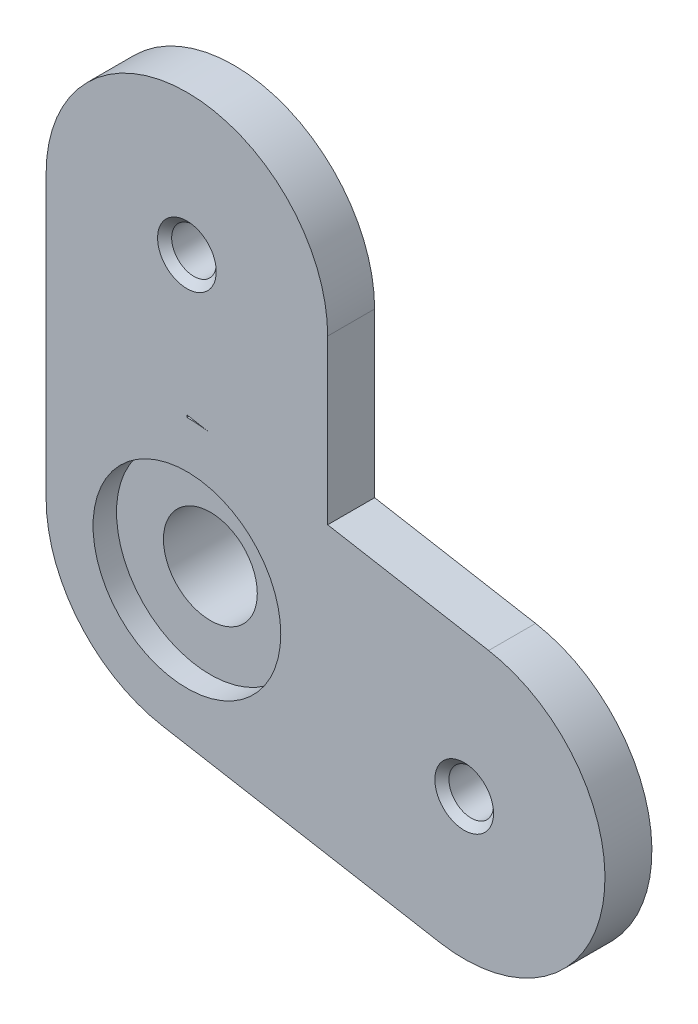
ISO-10303-21;
HEADER;
FILE_DESCRIPTION(('STEP AP214'),'2;1');
FILE_NAME('part.step','',(''),(''),'','','');
FILE_SCHEMA(('AUTOMOTIVE_DESIGN { 1 0 10303 214 1 1 1 1 }'));
ENDSEC;
DATA;
#1=APPLICATION_CONTEXT('core data for automotive mechanical design processes');
#2=APPLICATION_PROTOCOL_DEFINITION('international standard','automotive_design',2000,#1);
#3=PRODUCT_CONTEXT('',#1,'mechanical');
#4=PRODUCT('Part','Part','',(#3));
#5=PRODUCT_RELATED_PRODUCT_CATEGORY('part','',(#4));
#6=PRODUCT_DEFINITION_FORMATION('','',#4);
#7=PRODUCT_DEFINITION_CONTEXT('part definition',#1,'design');
#8=PRODUCT_DEFINITION('design','',#6,#7);
#9=PRODUCT_DEFINITION_SHAPE('','',#8);
#10=(LENGTH_UNIT() NAMED_UNIT(*) SI_UNIT(.MILLI.,.METRE.));
#11=(NAMED_UNIT(*) PLANE_ANGLE_UNIT() SI_UNIT($,.RADIAN.));
#12=(NAMED_UNIT(*) SI_UNIT($,.STERADIAN.) SOLID_ANGLE_UNIT());
#13=UNCERTAINTY_MEASURE_WITH_UNIT(LENGTH_MEASURE(1.E-05),#10,'distance_accuracy_value','');
#14=(GEOMETRIC_REPRESENTATION_CONTEXT(3) GLOBAL_UNCERTAINTY_ASSIGNED_CONTEXT((#13)) GLOBAL_UNIT_ASSIGNED_CONTEXT((#10,
#11,#12)) REPRESENTATION_CONTEXT('',''));
#15=CARTESIAN_POINT('',(0.,0.,0.));
#16=DIRECTION('',(0.,0.,1.));
#17=DIRECTION('',(1.,0.,0.));
#18=AXIS2_PLACEMENT_3D('',#15,#16,#17);
#19=CARTESIAN_POINT('',(0.,0.,1.));
#20=DIRECTION('',(0.,0.,-1.));
#21=DIRECTION('',(-1.,0.,0.));
#22=AXIS2_PLACEMENT_3D('',#19,#20,#21);
#23=CYLINDRICAL_SURFACE('',#22,1.);
#24=CARTESIAN_POINT('',(0.,0.,-1.55662432702596));
#25=DIRECTION('',(-0.499999999999995,0.,0.866025403784442));
#26=DIRECTION('',(-0.866025403784442,0.,-0.499999999999995));
#27=AXIS2_PLACEMENT_3D('',#24,#25,#26);
#28=ELLIPSE('',#27,1.15470053837925,1.);
#29=CARTESIAN_POINT('',(-1.,0.,-2.13397459621557));
#30=VERTEX_POINT('',#29);
#31=EDGE_CURVE('E193',#30,#30,#28,.F.);
#32=ORIENTED_EDGE('',*,*,#31,.T.);
#33=EDGE_LOOP('',(#32));
#34=FACE_BOUND('',#33,.T.);
#35=CARTESIAN_POINT('',(0.,0.,0.5));
#36=DIRECTION('',(0.,0.,1.));
#37=DIRECTION('',(1.,0.,0.));
#38=AXIS2_PLACEMENT_3D('',#35,#36,#37);
#39=CIRCLE('',#38,1.);
#40=CARTESIAN_POINT('',(1.,0.,0.5));
#41=VERTEX_POINT('',#40);
#42=EDGE_CURVE('E146',#41,#41,#39,.F.);
#43=ORIENTED_EDGE('',*,*,#42,.F.);
#44=EDGE_LOOP('',(#43));
#45=FACE_BOUND('',#44,.T.);
#46=ADVANCED_FACE('F36',(#34,#45),#23,.F.);
#47=CARTESIAN_POINT('',(0.,0.,1.));
#48=DIRECTION('',(0.,0.,-1.));
#49=DIRECTION('',(-1.,0.,0.));
#50=AXIS2_PLACEMENT_3D('',#47,#48,#49);
#51=CYLINDRICAL_SURFACE('',#50,3.);
#52=CARTESIAN_POINT('',(0.,0.,0.));
#53=DIRECTION('',(0.,0.,1.));
#54=DIRECTION('',(1.,0.,0.));
#55=AXIS2_PLACEMENT_3D('',#52,#53,#54);
#56=CIRCLE('',#55,3.);
#57=CARTESIAN_POINT('',(0.520944533000802,2.95442325903662,0.));
#58=VERTEX_POINT('',#57);
#59=CARTESIAN_POINT('',(0.,3.,0.));
#60=VERTEX_POINT('',#59);
#61=EDGE_CURVE('E131',#58,#60,#56,.T.);
#62=ORIENTED_EDGE('',*,*,#61,.T.);
#63=DIRECTION('',(0.,0.,-1.));
#64=VECTOR('',#63,1.);
#65=CARTESIAN_POINT('',(0.,3.,1.));
#66=LINE('',#65,#64);
#67=CARTESIAN_POINT('',(0.,3.,1.));
#68=VERTEX_POINT('',#67);
#69=EDGE_CURVE('E46',#68,#60,#66,.T.);
#70=ORIENTED_EDGE('',*,*,#69,.F.);
#71=CARTESIAN_POINT('',(0.,0.,1.));
#72=DIRECTION('',(0.,0.,1.));
#73=DIRECTION('',(1.,0.,0.));
#74=AXIS2_PLACEMENT_3D('',#71,#72,#73);
#75=CIRCLE('',#74,3.);
#76=CARTESIAN_POINT('',(0.520944533000802,2.95442325903662,1.));
#77=VERTEX_POINT('',#76);
#78=EDGE_CURVE('E120',#77,#68,#75,.T.);
#79=ORIENTED_EDGE('',*,*,#78,.F.);
#80=DIRECTION('',(0.,0.,-1.));
#81=VECTOR('',#80,1.);
#82=CARTESIAN_POINT('',(0.520944533000802,2.95442325903662,1.));
#83=LINE('',#82,#81);
#84=EDGE_CURVE('E168',#77,#58,#83,.T.);
#85=ORIENTED_EDGE('',*,*,#84,.T.);
#86=EDGE_LOOP('',(#62,#70,#79,#85));
#87=FACE_BOUND('',#86,.T.);
#88=ADVANCED_FACE('F129',(#87),#51,.T.);
#89=CARTESIAN_POINT('',(0.,0.,1.));
#90=DIRECTION('',(1.,0.,0.));
#91=DIRECTION('',(0.,1.,0.));
#92=AXIS2_PLACEMENT_3D('',#89,#90,#91);
#93=PLANE('',#92);
#94=DIRECTION('',(0.,-1.,0.));
#95=VECTOR('',#94,1.);
#96=CARTESIAN_POINT('',(0.,0.,0.));
#97=LINE('',#96,#95);
#98=CARTESIAN_POINT('',(0.,3.04627983565724,0.));
#99=VERTEX_POINT('',#98);
#100=EDGE_CURVE('E164',#99,#60,#97,.T.);
#101=ORIENTED_EDGE('',*,*,#100,.F.);
#102=DIRECTION('',(0.,0.,-1.));
#103=VECTOR('',#102,1.);
#104=CARTESIAN_POINT('',(0.,3.04627983565724,1.));
#105=LINE('',#104,#103);
#106=CARTESIAN_POINT('',(0.,3.04627983565724,1.));
#107=VERTEX_POINT('',#106);
#108=EDGE_CURVE('E89',#107,#99,#105,.T.);
#109=ORIENTED_EDGE('',*,*,#108,.F.);
#110=DIRECTION('',(0.,-1.,0.));
#111=VECTOR('',#110,1.);
#112=CARTESIAN_POINT('',(0.,0.,1.));
#113=LINE('',#112,#111);
#114=EDGE_CURVE('E124',#107,#68,#113,.T.);
#115=ORIENTED_EDGE('',*,*,#114,.T.);
#116=ORIENTED_EDGE('',*,*,#69,.T.);
#117=EDGE_LOOP('',(#101,#109,#115,#116));
#118=FACE_BOUND('',#117,.T.);
#119=ADVANCED_FACE('F136',(#118),#93,.T.);
#120=CARTESIAN_POINT('',(-0.520944533000801,-2.95442325903663,1.));
#121=DIRECTION('',(-0.173648177666934,-0.984807753012208,0.));
#122=DIRECTION('',(0.984807753012208,-0.173648177666934,0.));
#123=AXIS2_PLACEMENT_3D('',#120,#121,#122);
#124=PLANE('',#123);
#125=DIRECTION('',(-0.984807753012208,0.173648177666934,0.));
#126=VECTOR('',#125,1.);
#127=CARTESIAN_POINT('',(-0.520944533000801,-2.95442325903663,0.));
#128=LINE('',#127,#126);
#129=CARTESIAN_POINT('',(5.38790198507244,-3.99631232503823,0.));
#130=VERTEX_POINT('',#129);
#131=CARTESIAN_POINT('',(-0.520944533000802,-2.95442325903662,0.));
#132=VERTEX_POINT('',#131);
#133=EDGE_CURVE('E142',#130,#132,#128,.T.);
#134=ORIENTED_EDGE('',*,*,#133,.F.);
#135=DIRECTION('',(0.,0.,-1.));
#136=VECTOR('',#135,1.);
#137=CARTESIAN_POINT('',(5.38790198507244,-3.99631232503823,1.));
#138=LINE('',#137,#136);
#139=CARTESIAN_POINT('',(5.38790198507244,-3.99631232503823,1.));
#140=VERTEX_POINT('',#139);
#141=EDGE_CURVE('E100',#140,#130,#138,.T.);
#142=ORIENTED_EDGE('',*,*,#141,.F.);
#143=DIRECTION('',(-0.984807753012208,0.173648177666934,0.));
#144=VECTOR('',#143,1.);
#145=CARTESIAN_POINT('',(-0.520944533000801,-2.95442325903663,1.));
#146=LINE('',#145,#144);
#147=CARTESIAN_POINT('',(-0.520944533000802,-2.95442325903662,1.));
#148=VERTEX_POINT('',#147);
#149=EDGE_CURVE('E167',#140,#148,#146,.T.);
#150=ORIENTED_EDGE('',*,*,#149,.T.);
#151=DIRECTION('',(0.,0.,-1.));
#152=VECTOR('',#151,1.);
#153=CARTESIAN_POINT('',(-0.520944533000802,-2.95442325903662,1.));
#154=LINE('',#153,#152);
#155=EDGE_CURVE('E138',#148,#132,#154,.T.);
#156=ORIENTED_EDGE('',*,*,#155,.T.);
#157=EDGE_LOOP('',(#134,#142,#150,#156));
#158=FACE_BOUND('',#157,.T.);
#159=ADVANCED_FACE('F38',(#158),#124,.T.);
#160=CARTESIAN_POINT('',(5.90884651807324,-1.0418890660016,1.));
#161=DIRECTION('',(0.,0.,-1.));
#162=DIRECTION('',(-1.,0.,0.));
#163=AXIS2_PLACEMENT_3D('',#160,#161,#162);
#164=CYLINDRICAL_SURFACE('',#163,3.);
#165=CARTESIAN_POINT('',(5.90884651807324,-1.0418890660016,0.));
#166=DIRECTION('',(0.,0.,1.));
#167=DIRECTION('',(1.,0.,0.));
#168=AXIS2_PLACEMENT_3D('',#165,#166,#167);
#169=CIRCLE('',#168,3.);
#170=CARTESIAN_POINT('',(6.42979105107405,1.91253419303502,0.));
#171=VERTEX_POINT('',#170);
#172=EDGE_CURVE('E145',#130,#171,#169,.T.);
#173=ORIENTED_EDGE('',*,*,#172,.T.);
#174=DIRECTION('',(0.,0.,-1.));
#175=VECTOR('',#174,1.);
#176=CARTESIAN_POINT('',(6.42979105107405,1.91253419303502,1.));
#177=LINE('',#176,#175);
#178=CARTESIAN_POINT('',(6.42979105107405,1.91253419303502,1.));
#179=VERTEX_POINT('',#178);
#180=EDGE_CURVE('E181',#179,#171,#177,.T.);
#181=ORIENTED_EDGE('',*,*,#180,.F.);
#182=CARTESIAN_POINT('',(5.90884651807324,-1.0418890660016,1.));
#183=DIRECTION('',(0.,0.,1.));
#184=DIRECTION('',(1.,0.,0.));
#185=AXIS2_PLACEMENT_3D('',#182,#183,#184);
#186=CIRCLE('',#185,3.);
#187=EDGE_CURVE('E212',#140,#179,#186,.T.);
#188=ORIENTED_EDGE('',*,*,#187,.F.);
#189=ORIENTED_EDGE('',*,*,#141,.T.);
#190=EDGE_LOOP('',(#173,#181,#188,#189));
#191=FACE_BOUND('',#190,.T.);
#192=ADVANCED_FACE('F232',(#191),#164,.T.);
#193=CARTESIAN_POINT('',(0.520944533000802,2.95442325903662,1.));
#194=DIRECTION('',(0.173648177666934,0.984807753012207,0.));
#195=DIRECTION('',(-0.984807753012208,0.173648177666934,0.));
#196=AXIS2_PLACEMENT_3D('',#193,#194,#195);
#197=PLANE('',#196);
#198=DIRECTION('',(0.984807753012208,-0.173648177666934,0.));
#199=VECTOR('',#198,1.);
#200=CARTESIAN_POINT('',(0.520944533000802,2.95442325903662,0.));
#201=LINE('',#200,#199);
#202=CARTESIAN_POINT('',(3.,2.51729889353183,0.));
#203=VERTEX_POINT('',#202);
#204=EDGE_CURVE('E149',#203,#171,#201,.T.);
#205=ORIENTED_EDGE('',*,*,#204,.F.);
#206=DIRECTION('',(0.,0.,-1.));
#207=VECTOR('',#206,1.);
#208=CARTESIAN_POINT('',(3.,2.51729889353183,1.));
#209=LINE('',#208,#207);
#210=CARTESIAN_POINT('',(3.,2.51729889353183,1.));
#211=VERTEX_POINT('',#210);
#212=EDGE_CURVE('E179',#211,#203,#209,.T.);
#213=ORIENTED_EDGE('',*,*,#212,.F.);
#214=DIRECTION('',(0.984807753012208,-0.173648177666934,0.));
#215=VECTOR('',#214,1.);
#216=CARTESIAN_POINT('',(0.520944533000802,2.95442325903662,1.));
#217=LINE('',#216,#215);
#218=EDGE_CURVE('E214',#211,#179,#217,.T.);
#219=ORIENTED_EDGE('',*,*,#218,.T.);
#220=ORIENTED_EDGE('',*,*,#180,.T.);
#221=EDGE_LOOP('',(#205,#213,#219,#220));
#222=FACE_BOUND('',#221,.T.);
#223=ADVANCED_FACE('F237',(#222),#197,.T.);
#224=CARTESIAN_POINT('',(3.,0.,1.));
#225=DIRECTION('',(-1.,0.,0.));
#226=DIRECTION('',(0.,-1.,0.));
#227=AXIS2_PLACEMENT_3D('',#224,#225,#226);
#228=PLANE('',#227);
#229=DIRECTION('',(0.,1.,0.));
#230=VECTOR('',#229,1.);
#231=CARTESIAN_POINT('',(3.,0.,0.));
#232=LINE('',#231,#230);
#233=CARTESIAN_POINT('',(3.,6.,0.));
#234=VERTEX_POINT('',#233);
#235=EDGE_CURVE('E152',#203,#234,#232,.T.);
#236=ORIENTED_EDGE('',*,*,#235,.T.);
#237=DIRECTION('',(0.,0.,-1.));
#238=VECTOR('',#237,1.);
#239=CARTESIAN_POINT('',(3.,6.,1.));
#240=LINE('',#239,#238);
#241=CARTESIAN_POINT('',(3.,6.,1.));
#242=VERTEX_POINT('',#241);
#243=EDGE_CURVE('E176',#242,#234,#240,.T.);
#244=ORIENTED_EDGE('',*,*,#243,.F.);
#245=DIRECTION('',(0.,1.,0.));
#246=VECTOR('',#245,1.);
#247=CARTESIAN_POINT('',(3.,0.,1.));
#248=LINE('',#247,#246);
#249=EDGE_CURVE('E217',#211,#242,#248,.T.);
#250=ORIENTED_EDGE('',*,*,#249,.F.);
#251=ORIENTED_EDGE('',*,*,#212,.T.);
#252=EDGE_LOOP('',(#236,#244,#250,#251));
#253=FACE_BOUND('',#252,.T.);
#254=ADVANCED_FACE('F276',(#253),#228,.F.);
#255=CARTESIAN_POINT('',(0.,6.,1.));
#256=DIRECTION('',(0.,0.,-1.));
#257=DIRECTION('',(-1.,0.,0.));
#258=AXIS2_PLACEMENT_3D('',#255,#256,#257);
#259=CYLINDRICAL_SURFACE('',#258,3.);
#260=CARTESIAN_POINT('',(0.,6.,0.));
#261=DIRECTION('',(0.,0.,1.));
#262=DIRECTION('',(1.,0.,0.));
#263=AXIS2_PLACEMENT_3D('',#260,#261,#262);
#264=CIRCLE('',#263,3.);
#265=CARTESIAN_POINT('',(-3.,6.,0.));
#266=VERTEX_POINT('',#265);
#267=EDGE_CURVE('E154',#234,#266,#264,.T.);
#268=ORIENTED_EDGE('',*,*,#267,.T.);
#269=DIRECTION('',(0.,0.,-1.));
#270=VECTOR('',#269,1.);
#271=CARTESIAN_POINT('',(-3.,6.,1.));
#272=LINE('',#271,#270);
#273=CARTESIAN_POINT('',(-3.,6.,1.));
#274=VERTEX_POINT('',#273);
#275=EDGE_CURVE('E174',#274,#266,#272,.T.);
#276=ORIENTED_EDGE('',*,*,#275,.F.);
#277=CARTESIAN_POINT('',(0.,6.,1.));
#278=DIRECTION('',(0.,0.,1.));
#279=DIRECTION('',(1.,0.,0.));
#280=AXIS2_PLACEMENT_3D('',#277,#278,#279);
#281=CIRCLE('',#280,3.);
#282=EDGE_CURVE('E219',#242,#274,#281,.T.);
#283=ORIENTED_EDGE('',*,*,#282,.F.);
#284=ORIENTED_EDGE('',*,*,#243,.T.);
#285=EDGE_LOOP('',(#268,#276,#283,#284));
#286=FACE_BOUND('',#285,.T.);
#287=ADVANCED_FACE('F272',(#286),#259,.T.);
#288=CARTESIAN_POINT('',(-3.,0.,1.));
#289=DIRECTION('',(-1.,0.,0.));
#290=DIRECTION('',(0.,-1.,0.));
#291=AXIS2_PLACEMENT_3D('',#288,#289,#290);
#292=PLANE('',#291);
#293=DIRECTION('',(0.,1.,0.));
#294=VECTOR('',#293,1.);
#295=CARTESIAN_POINT('',(-3.,0.,0.));
#296=LINE('',#295,#294);
#297=CARTESIAN_POINT('',(-3.,0.,0.));
#298=VERTEX_POINT('',#297);
#299=EDGE_CURVE('E157',#298,#266,#296,.T.);
#300=ORIENTED_EDGE('',*,*,#299,.F.);
#301=DIRECTION('',(0.,0.,-1.));
#302=VECTOR('',#301,1.);
#303=CARTESIAN_POINT('',(-3.,0.,1.));
#304=LINE('',#303,#302);
#305=CARTESIAN_POINT('',(-3.,0.,1.));
#306=VERTEX_POINT('',#305);
#307=EDGE_CURVE('E172',#306,#298,#304,.T.);
#308=ORIENTED_EDGE('',*,*,#307,.F.);
#309=DIRECTION('',(0.,1.,0.));
#310=VECTOR('',#309,1.);
#311=CARTESIAN_POINT('',(-3.,0.,1.));
#312=LINE('',#311,#310);
#313=EDGE_CURVE('E221',#306,#274,#312,.T.);
#314=ORIENTED_EDGE('',*,*,#313,.T.);
#315=ORIENTED_EDGE('',*,*,#275,.T.);
#316=EDGE_LOOP('',(#300,#308,#314,#315));
#317=FACE_BOUND('',#316,.T.);
#318=ADVANCED_FACE('F269',(#317),#292,.T.);
#319=CARTESIAN_POINT('',(0.,0.,1.));
#320=DIRECTION('',(0.,0.,-1.));
#321=DIRECTION('',(-1.,0.,0.));
#322=AXIS2_PLACEMENT_3D('',#319,#320,#321);
#323=CYLINDRICAL_SURFACE('',#322,3.);
#324=CARTESIAN_POINT('',(0.,0.,0.));
#325=DIRECTION('',(0.,0.,1.));
#326=DIRECTION('',(1.,0.,0.));
#327=AXIS2_PLACEMENT_3D('',#324,#325,#326);
#328=CIRCLE('',#327,3.);
#329=EDGE_CURVE('E160',#298,#132,#328,.T.);
#330=ORIENTED_EDGE('',*,*,#329,.T.);
#331=ORIENTED_EDGE('',*,*,#155,.F.);
#332=CARTESIAN_POINT('',(0.,0.,1.));
#333=DIRECTION('',(0.,0.,1.));
#334=DIRECTION('',(1.,0.,0.));
#335=AXIS2_PLACEMENT_3D('',#332,#333,#334);
#336=CIRCLE('',#335,3.);
#337=EDGE_CURVE('E126',#306,#148,#336,.T.);
#338=ORIENTED_EDGE('',*,*,#337,.F.);
#339=ORIENTED_EDGE('',*,*,#307,.T.);
#340=EDGE_LOOP('',(#330,#331,#338,#339));
#341=FACE_BOUND('',#340,.T.);
#342=ADVANCED_FACE('F229',(#341),#323,.T.);
#343=CARTESIAN_POINT('',(0.520944533000802,2.95442325903662,1.));
#344=DIRECTION('',(0.173648177666934,0.984807753012207,0.));
#345=DIRECTION('',(-0.984807753012208,0.173648177666934,0.));
#346=AXIS2_PLACEMENT_3D('',#343,#344,#345);
#347=PLANE('',#346);
#348=DIRECTION('',(0.984807753012208,-0.173648177666934,0.));
#349=VECTOR('',#348,1.);
#350=CARTESIAN_POINT('',(0.520944533000802,2.95442325903662,0.));
#351=LINE('',#350,#349);
#352=EDGE_CURVE('E92',#99,#58,#351,.T.);
#353=ORIENTED_EDGE('',*,*,#352,.T.);
#354=ORIENTED_EDGE('',*,*,#84,.F.);
#355=DIRECTION('',(0.984807753012208,-0.173648177666934,0.));
#356=VECTOR('',#355,1.);
#357=CARTESIAN_POINT('',(0.520944533000802,2.95442325903662,1.));
#358=LINE('',#357,#356);
#359=EDGE_CURVE('E55',#107,#77,#358,.T.);
#360=ORIENTED_EDGE('',*,*,#359,.F.);
#361=ORIENTED_EDGE('',*,*,#108,.T.);
#362=EDGE_LOOP('',(#353,#354,#360,#361));
#363=FACE_BOUND('',#362,.T.);
#364=ADVANCED_FACE('F260',(#363),#347,.F.);
#365=CARTESIAN_POINT('',(0.,0.,1.));
#366=DIRECTION('',(0.,0.,1.));
#367=DIRECTION('',(1.,0.,0.));
#368=AXIS2_PLACEMENT_3D('',#365,#366,#367);
#369=PLANE('',#368);
#370=CARTESIAN_POINT('',(0.,6.,1.));
#371=DIRECTION('',(0.,0.,1.));
#372=DIRECTION('',(1.,0.,0.));
#373=AXIS2_PLACEMENT_3D('',#370,#371,#372);
#374=CIRCLE('',#373,0.625);
#375=CARTESIAN_POINT('',(0.625,6.,1.));
#376=VERTEX_POINT('',#375);
#377=EDGE_CURVE('E508',#376,#376,#374,.T.);
#378=ORIENTED_EDGE('',*,*,#377,.F.);
#379=EDGE_LOOP('',(#378));
#380=FACE_BOUND('',#379,.T.);
#381=CARTESIAN_POINT('',(5.90884651807324,-1.0418890660016,1.));
#382=DIRECTION('',(0.,0.,1.));
#383=DIRECTION('',(1.,0.,0.));
#384=AXIS2_PLACEMENT_3D('',#381,#382,#383);
#385=CIRCLE('',#384,0.625);
#386=CARTESIAN_POINT('',(6.53384651807324,-1.0418890660016,1.));
#387=VERTEX_POINT('',#386);
#388=EDGE_CURVE('E196',#387,#387,#385,.T.);
#389=ORIENTED_EDGE('',*,*,#388,.F.);
#390=EDGE_LOOP('',(#389));
#391=FACE_BOUND('',#390,.T.);
#392=CARTESIAN_POINT('',(0.,0.,1.));
#393=DIRECTION('',(0.,0.,1.));
#394=DIRECTION('',(1.,0.,0.));
#395=AXIS2_PLACEMENT_3D('',#392,#393,#394);
#396=CIRCLE('',#395,2.);
#397=CARTESIAN_POINT('',(2.,0.,1.));
#398=VERTEX_POINT('',#397);
#399=EDGE_CURVE('E206',#398,#398,#396,.T.);
#400=ORIENTED_EDGE('',*,*,#399,.F.);
#401=EDGE_LOOP('',(#400));
#402=FACE_BOUND('',#401,.T.);
#403=ORIENTED_EDGE('',*,*,#149,.F.);
#404=ORIENTED_EDGE('',*,*,#187,.T.);
#405=ORIENTED_EDGE('',*,*,#218,.F.);
#406=ORIENTED_EDGE('',*,*,#249,.T.);
#407=ORIENTED_EDGE('',*,*,#282,.T.);
#408=ORIENTED_EDGE('',*,*,#313,.F.);
#409=ORIENTED_EDGE('',*,*,#337,.T.);
#410=EDGE_LOOP('',(#403,#404,#405,#406,#407,#408,#409));
#411=FACE_BOUND('',#410,.T.);
#412=ORIENTED_EDGE('',*,*,#78,.T.);
#413=ORIENTED_EDGE('',*,*,#114,.F.);
#414=ORIENTED_EDGE('',*,*,#359,.T.);
#415=EDGE_LOOP('',(#412,#413,#414));
#416=FACE_BOUND('',#415,.T.);
#417=ADVANCED_FACE('F122',(#380,#391,#402,#411,#416),#369,.T.);
#418=CARTESIAN_POINT('',(0.,0.,0.));
#419=DIRECTION('',(0.,0.,1.));
#420=DIRECTION('',(1.,0.,0.));
#421=AXIS2_PLACEMENT_3D('',#418,#419,#420);
#422=PLANE('',#421);
#423=CARTESIAN_POINT('',(0.,6.,0.));
#424=DIRECTION('',(0.,0.,1.));
#425=DIRECTION('',(1.,0.,0.));
#426=AXIS2_PLACEMENT_3D('',#423,#424,#425);
#427=CIRCLE('',#426,0.474999999999999);
#428=CARTESIAN_POINT('',(0.475,6.,0.));
#429=VERTEX_POINT('',#428);
#430=EDGE_CURVE('E40',#429,#429,#427,.T.);
#431=ORIENTED_EDGE('',*,*,#430,.T.);
#432=EDGE_LOOP('',(#431));
#433=FACE_BOUND('',#432,.T.);
#434=CARTESIAN_POINT('',(5.90884651807324,-1.0418890660016,0.));
#435=DIRECTION('',(0.,0.,1.));
#436=DIRECTION('',(1.,0.,0.));
#437=AXIS2_PLACEMENT_3D('',#434,#435,#436);
#438=CIRCLE('',#437,0.474999999999999);
#439=CARTESIAN_POINT('',(6.38384651807324,-1.0418890660016,0.));
#440=VERTEX_POINT('',#439);
#441=EDGE_CURVE('E186',#440,#440,#438,.T.);
#442=ORIENTED_EDGE('',*,*,#441,.T.);
#443=EDGE_LOOP('',(#442));
#444=FACE_BOUND('',#443,.T.);
#445=CARTESIAN_POINT('',(0.,0.,0.));
#446=DIRECTION('',(0.,0.,1.));
#447=DIRECTION('',(1.,0.,0.));
#448=AXIS2_PLACEMENT_3D('',#445,#446,#447);
#449=CIRCLE('',#448,2.5);
#450=CARTESIAN_POINT('',(2.5,0.,0.));
#451=VERTEX_POINT('',#450);
#452=EDGE_CURVE('E11',#451,#451,#449,.F.);
#453=ORIENTED_EDGE('',*,*,#452,.F.);
#454=EDGE_LOOP('',(#453));
#455=FACE_BOUND('',#454,.T.);
#456=ORIENTED_EDGE('',*,*,#133,.T.);
#457=ORIENTED_EDGE('',*,*,#329,.F.);
#458=ORIENTED_EDGE('',*,*,#299,.T.);
#459=ORIENTED_EDGE('',*,*,#267,.F.);
#460=ORIENTED_EDGE('',*,*,#235,.F.);
#461=ORIENTED_EDGE('',*,*,#204,.T.);
#462=ORIENTED_EDGE('',*,*,#172,.F.);
#463=EDGE_LOOP('',(#456,#457,#458,#459,#460,#461,#462));
#464=FACE_BOUND('',#463,.T.);
#465=ORIENTED_EDGE('',*,*,#61,.F.);
#466=ORIENTED_EDGE('',*,*,#352,.F.);
#467=ORIENTED_EDGE('',*,*,#100,.T.);
#468=EDGE_LOOP('',(#465,#466,#467));
#469=FACE_BOUND('',#468,.T.);
#470=ADVANCED_FACE('F256',(#433,#444,#455,#464,#469),#422,.F.);
#471=CARTESIAN_POINT('',(0.,0.,-3.));
#472=DIRECTION('',(0.,0.,1.));
#473=DIRECTION('',(1.,0.,0.));
#474=AXIS2_PLACEMENT_3D('',#471,#472,#473);
#475=CYLINDRICAL_SURFACE('',#474,2.5);
#476=CARTESIAN_POINT('',(0.,0.,-1.55662432702596));
#477=DIRECTION('',(-0.499999999999995,0.,0.866025403784442));
#478=DIRECTION('',(0.866025403784442,0.,0.499999999999995));
#479=AXIS2_PLACEMENT_3D('',#476,#477,#478);
#480=ELLIPSE('',#479,2.88675134594812,2.5);
#481=CARTESIAN_POINT('',(2.5,0.,-0.113248654051913));
#482=VERTEX_POINT('',#481);
#483=EDGE_CURVE('E188',#482,#482,#480,.T.);
#484=ORIENTED_EDGE('',*,*,#483,.T.);
#485=EDGE_LOOP('',(#484));
#486=FACE_BOUND('',#485,.T.);
#487=ORIENTED_EDGE('',*,*,#452,.T.);
#488=EDGE_LOOP('',(#487));
#489=FACE_BOUND('',#488,.T.);
#490=ADVANCED_FACE('F252',(#486,#489),#475,.T.);
#491=CARTESIAN_POINT('',(0.,0.,0.5));
#492=DIRECTION('',(0.,0.,1.));
#493=DIRECTION('',(1.,0.,0.));
#494=AXIS2_PLACEMENT_3D('',#491,#492,#493);
#495=PLANE('',#494);
#496=CARTESIAN_POINT('',(0.,0.,0.5));
#497=DIRECTION('',(0.,0.,1.));
#498=DIRECTION('',(1.,0.,0.));
#499=AXIS2_PLACEMENT_3D('',#496,#497,#498);
#500=CIRCLE('',#499,2.);
#501=CARTESIAN_POINT('',(2.,0.,0.5));
#502=VERTEX_POINT('',#501);
#503=EDGE_CURVE('E185',#502,#502,#500,.T.);
#504=ORIENTED_EDGE('',*,*,#503,.T.);
#505=EDGE_LOOP('',(#504));
#506=FACE_BOUND('',#505,.T.);
#507=ORIENTED_EDGE('',*,*,#42,.T.);
#508=EDGE_LOOP('',(#507));
#509=FACE_BOUND('',#508,.T.);
#510=ADVANCED_FACE('F255',(#506,#509),#495,.T.);
#511=CARTESIAN_POINT('',(0.,0.,0.5));
#512=DIRECTION('',(0.,0.,1.));
#513=DIRECTION('',(1.,0.,0.));
#514=AXIS2_PLACEMENT_3D('',#511,#512,#513);
#515=CYLINDRICAL_SURFACE('',#514,2.);
#516=ORIENTED_EDGE('',*,*,#503,.F.);
#517=EDGE_LOOP('',(#516));
#518=FACE_BOUND('',#517,.T.);
#519=ORIENTED_EDGE('',*,*,#399,.T.);
#520=EDGE_LOOP('',(#519));
#521=FACE_BOUND('',#520,.T.);
#522=ADVANCED_FACE('F250',(#518,#521),#515,.F.);
#523=CARTESIAN_POINT('',(-2.5,-4.04188906600161,-3.));
#524=DIRECTION('',(-0.499999999999995,0.,0.866025403784442));
#525=DIRECTION('',(0.866025403784442,0.,0.499999999999995));
#526=AXIS2_PLACEMENT_3D('',#523,#524,#525);
#527=PLANE('',#526);
#528=ORIENTED_EDGE('',*,*,#483,.F.);
#529=EDGE_LOOP('',(#528));
#530=FACE_BOUND('',#529,.T.);
#531=ORIENTED_EDGE('',*,*,#31,.F.);
#532=EDGE_LOOP('',(#531));
#533=FACE_BOUND('',#532,.T.);
#534=ADVANCED_FACE('F346',(#530,#533),#527,.F.);
#535=CARTESIAN_POINT('',(5.90884651807324,-1.0418890660016,1.));
#536=DIRECTION('',(0.,0.,1.));
#537=DIRECTION('',(1.,0.,0.));
#538=AXIS2_PLACEMENT_3D('',#535,#536,#537);
#539=CYLINDRICAL_SURFACE('',#538,0.474999999999999);
#540=CARTESIAN_POINT('',(5.90884651807324,-1.0418890660016,0.85));
#541=DIRECTION('',(0.,0.,1.));
#542=DIRECTION('',(1.,0.,0.));
#543=AXIS2_PLACEMENT_3D('',#540,#541,#542);
#544=CIRCLE('',#543,0.475);
#545=CARTESIAN_POINT('',(6.38384651807324,-1.0418890660016,0.85));
#546=VERTEX_POINT('',#545);
#547=EDGE_CURVE('E189',#546,#546,#544,.T.);
#548=ORIENTED_EDGE('',*,*,#547,.T.);
#549=EDGE_LOOP('',(#548));
#550=FACE_BOUND('',#549,.T.);
#551=ORIENTED_EDGE('',*,*,#441,.F.);
#552=EDGE_LOOP('',(#551));
#553=FACE_BOUND('',#552,.T.);
#554=ADVANCED_FACE('F352',(#550,#553),#539,.F.);
#555=CARTESIAN_POINT('',(5.90884651807324,-1.0418890660016,1.));
#556=DIRECTION('',(0.,0.,1.));
#557=DIRECTION('',(1.,0.,0.));
#558=AXIS2_PLACEMENT_3D('',#555,#556,#557);
#559=CONICAL_SURFACE('',#558,0.625,0.785398163397448);
#560=ORIENTED_EDGE('',*,*,#547,.F.);
#561=EDGE_LOOP('',(#560));
#562=FACE_BOUND('',#561,.T.);
#563=ORIENTED_EDGE('',*,*,#388,.T.);
#564=EDGE_LOOP('',(#563));
#565=FACE_BOUND('',#564,.T.);
#566=ADVANCED_FACE('F360',(#562,#565),#559,.F.);
#567=CARTESIAN_POINT('',(0.,6.,1.));
#568=DIRECTION('',(0.,0.,1.));
#569=DIRECTION('',(1.,0.,0.));
#570=AXIS2_PLACEMENT_3D('',#567,#568,#569);
#571=CYLINDRICAL_SURFACE('',#570,0.474999999999999);
#572=CARTESIAN_POINT('',(0.,6.,0.85));
#573=DIRECTION('',(0.,0.,1.));
#574=DIRECTION('',(1.,0.,0.));
#575=AXIS2_PLACEMENT_3D('',#572,#573,#574);
#576=CIRCLE('',#575,0.474999999999999);
#577=CARTESIAN_POINT('',(0.475,6.,0.85));
#578=VERTEX_POINT('',#577);
#579=EDGE_CURVE('E505',#578,#578,#576,.T.);
#580=ORIENTED_EDGE('',*,*,#579,.T.);
#581=EDGE_LOOP('',(#580));
#582=FACE_BOUND('',#581,.T.);
#583=ORIENTED_EDGE('',*,*,#430,.F.);
#584=EDGE_LOOP('',(#583));
#585=FACE_BOUND('',#584,.T.);
#586=ADVANCED_FACE('F367',(#582,#585),#571,.F.);
#587=CARTESIAN_POINT('',(0.,6.,1.));
#588=DIRECTION('',(0.,0.,1.));
#589=DIRECTION('',(1.,0.,0.));
#590=AXIS2_PLACEMENT_3D('',#587,#588,#589);
#591=CONICAL_SURFACE('',#590,0.625,0.78539816339745);
#592=ORIENTED_EDGE('',*,*,#579,.F.);
#593=EDGE_LOOP('',(#592));
#594=FACE_BOUND('',#593,.T.);
#595=ORIENTED_EDGE('',*,*,#377,.T.);
#596=EDGE_LOOP('',(#595));
#597=FACE_BOUND('',#596,.T.);
#598=ADVANCED_FACE('F375',(#594,#597),#591,.F.);
#599=CLOSED_SHELL('',(#46,#88,#119,#159,#192,#223,#254,#287,#318,#342,#364,#417,#470,#490,#510,
#522,#534,#554,#566,#586,#598));
#600=MANIFOLD_SOLID_BREP('B2',#599);
#601=ADVANCED_BREP_SHAPE_REPRESENTATION('',(#18,#600),#14);
#602=SHAPE_DEFINITION_REPRESENTATION(#9,#601);
ENDSEC;
END-ISO-10303-21;
